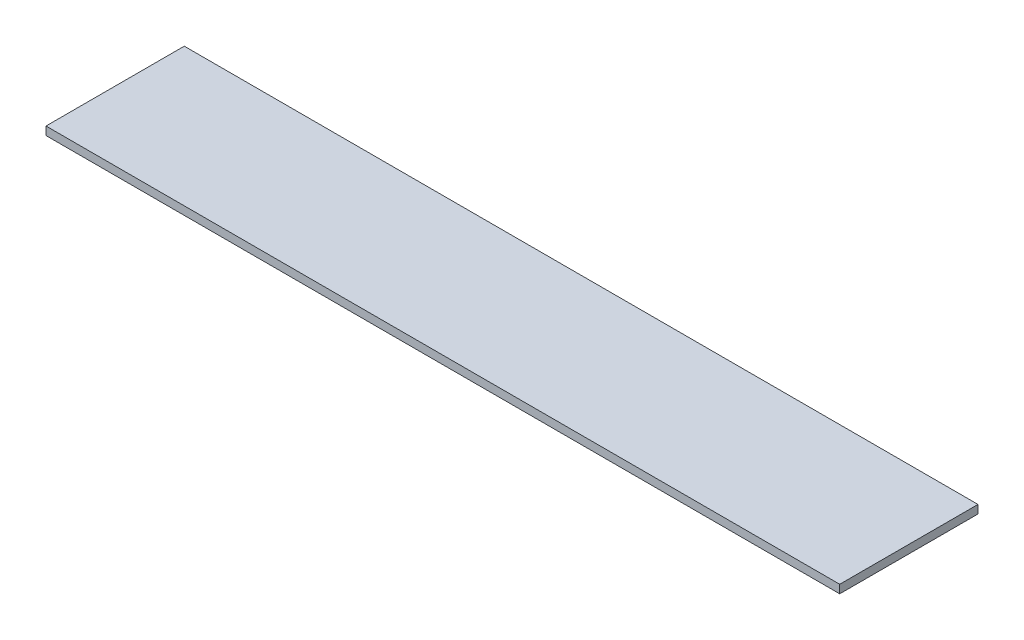
ISO-10303-21;
HEADER;
FILE_DESCRIPTION(('STEP AP214'),'2;1');
FILE_NAME('part.step','',(''),(''),'','','');
FILE_SCHEMA(('AUTOMOTIVE_DESIGN { 1 0 10303 214 1 1 1 1 }'));
ENDSEC;
DATA;
#1=APPLICATION_CONTEXT('core data for automotive mechanical design processes');
#2=APPLICATION_PROTOCOL_DEFINITION('international standard','automotive_design',2000,#1);
#3=PRODUCT_CONTEXT('',#1,'mechanical');
#4=PRODUCT('Part','Part','',(#3));
#5=PRODUCT_RELATED_PRODUCT_CATEGORY('part','',(#4));
#6=PRODUCT_DEFINITION_FORMATION('','',#4);
#7=PRODUCT_DEFINITION_CONTEXT('part definition',#1,'design');
#8=PRODUCT_DEFINITION('design','',#6,#7);
#9=PRODUCT_DEFINITION_SHAPE('','',#8);
#10=(LENGTH_UNIT() NAMED_UNIT(*) SI_UNIT(.MILLI.,.METRE.));
#11=(NAMED_UNIT(*) PLANE_ANGLE_UNIT() SI_UNIT($,.RADIAN.));
#12=(NAMED_UNIT(*) SI_UNIT($,.STERADIAN.) SOLID_ANGLE_UNIT());
#13=UNCERTAINTY_MEASURE_WITH_UNIT(LENGTH_MEASURE(1.E-05),#10,'distance_accuracy_value','');
#14=(GEOMETRIC_REPRESENTATION_CONTEXT(3) GLOBAL_UNCERTAINTY_ASSIGNED_CONTEXT((#13)) GLOBAL_UNIT_ASSIGNED_CONTEXT((#10,
#11,#12)) REPRESENTATION_CONTEXT('',''));
#15=CARTESIAN_POINT('',(0.,0.,0.));
#16=DIRECTION('',(0.,0.,1.));
#17=DIRECTION('',(1.,0.,0.));
#18=AXIS2_PLACEMENT_3D('',#15,#16,#17);
#19=CARTESIAN_POINT('',(143.5,3.,25.));
#20=DIRECTION('',(-1.,0.,0.));
#21=DIRECTION('',(0.,0.,1.));
#22=AXIS2_PLACEMENT_3D('',#19,#20,#21);
#23=PLANE('',#22);
#24=DIRECTION('',(0.,0.,-1.));
#25=VECTOR('',#24,1.);
#26=CARTESIAN_POINT('',(143.5,0.,25.));
#27=LINE('',#26,#25);
#28=CARTESIAN_POINT('',(143.5,0.,25.));
#29=VERTEX_POINT('',#28);
#30=CARTESIAN_POINT('',(143.5,0.,-25.));
#31=VERTEX_POINT('',#30);
#32=EDGE_CURVE('E100',#29,#31,#27,.T.);
#33=ORIENTED_EDGE('',*,*,#32,.T.);
#34=DIRECTION('',(0.,-1.,0.));
#35=VECTOR('',#34,1.);
#36=CARTESIAN_POINT('',(143.5,3.,-25.));
#37=LINE('',#36,#35);
#38=CARTESIAN_POINT('',(143.5,3.,-25.));
#39=VERTEX_POINT('',#38);
#40=EDGE_CURVE('E11',#39,#31,#37,.T.);
#41=ORIENTED_EDGE('',*,*,#40,.F.);
#42=DIRECTION('',(0.,0.,-1.));
#43=VECTOR('',#42,1.);
#44=CARTESIAN_POINT('',(143.5,3.,25.));
#45=LINE('',#44,#43);
#46=CARTESIAN_POINT('',(143.5,3.,25.));
#47=VERTEX_POINT('',#46);
#48=EDGE_CURVE('E88',#47,#39,#45,.T.);
#49=ORIENTED_EDGE('',*,*,#48,.F.);
#50=DIRECTION('',(0.,-1.,0.));
#51=VECTOR('',#50,1.);
#52=CARTESIAN_POINT('',(143.5,3.,25.));
#53=LINE('',#52,#51);
#54=EDGE_CURVE('E96',#47,#29,#53,.T.);
#55=ORIENTED_EDGE('',*,*,#54,.T.);
#56=EDGE_LOOP('',(#33,#41,#49,#55));
#57=FACE_BOUND('',#56,.T.);
#58=ADVANCED_FACE('F37',(#57),#23,.F.);
#59=CARTESIAN_POINT('',(-143.5,3.,-25.));
#60=DIRECTION('',(0.,0.,1.));
#61=DIRECTION('',(1.,0.,0.));
#62=AXIS2_PLACEMENT_3D('',#59,#60,#61);
#63=PLANE('',#62);
#64=DIRECTION('',(-1.,0.,0.));
#65=VECTOR('',#64,1.);
#66=CARTESIAN_POINT('',(-143.5,0.,-25.));
#67=LINE('',#66,#65);
#68=CARTESIAN_POINT('',(-143.5,0.,-25.));
#69=VERTEX_POINT('',#68);
#70=EDGE_CURVE('E92',#31,#69,#67,.T.);
#71=ORIENTED_EDGE('',*,*,#70,.T.);
#72=DIRECTION('',(0.,-1.,0.));
#73=VECTOR('',#72,1.);
#74=CARTESIAN_POINT('',(-143.5,3.,-25.));
#75=LINE('',#74,#73);
#76=CARTESIAN_POINT('',(-143.5,3.,-25.));
#77=VERTEX_POINT('',#76);
#78=EDGE_CURVE('E45',#77,#69,#75,.T.);
#79=ORIENTED_EDGE('',*,*,#78,.F.);
#80=DIRECTION('',(-1.,0.,0.));
#81=VECTOR('',#80,1.);
#82=CARTESIAN_POINT('',(-143.5,3.,-25.));
#83=LINE('',#82,#81);
#84=EDGE_CURVE('E83',#39,#77,#83,.T.);
#85=ORIENTED_EDGE('',*,*,#84,.F.);
#86=ORIENTED_EDGE('',*,*,#40,.T.);
#87=EDGE_LOOP('',(#71,#79,#85,#86));
#88=FACE_BOUND('',#87,.T.);
#89=ADVANCED_FACE('F91',(#88),#63,.F.);
#90=CARTESIAN_POINT('',(-143.5,3.,25.));
#91=DIRECTION('',(1.,0.,0.));
#92=DIRECTION('',(0.,0.,-1.));
#93=AXIS2_PLACEMENT_3D('',#90,#91,#92);
#94=PLANE('',#93);
#95=DIRECTION('',(0.,0.,1.));
#96=VECTOR('',#95,1.);
#97=CARTESIAN_POINT('',(-143.5,0.,25.));
#98=LINE('',#97,#96);
#99=CARTESIAN_POINT('',(-143.5,0.,25.));
#100=VERTEX_POINT('',#99);
#101=EDGE_CURVE('E70',#69,#100,#98,.T.);
#102=ORIENTED_EDGE('',*,*,#101,.T.);
#103=DIRECTION('',(0.,-1.,0.));
#104=VECTOR('',#103,1.);
#105=CARTESIAN_POINT('',(-143.5,3.,25.));
#106=LINE('',#105,#104);
#107=CARTESIAN_POINT('',(-143.5,3.,25.));
#108=VERTEX_POINT('',#107);
#109=EDGE_CURVE('E93',#108,#100,#106,.T.);
#110=ORIENTED_EDGE('',*,*,#109,.F.);
#111=DIRECTION('',(0.,0.,1.));
#112=VECTOR('',#111,1.);
#113=CARTESIAN_POINT('',(-143.5,3.,25.));
#114=LINE('',#113,#112);
#115=EDGE_CURVE('E86',#77,#108,#114,.T.);
#116=ORIENTED_EDGE('',*,*,#115,.F.);
#117=ORIENTED_EDGE('',*,*,#78,.T.);
#118=EDGE_LOOP('',(#102,#110,#116,#117));
#119=FACE_BOUND('',#118,.T.);
#120=ADVANCED_FACE('F94',(#119),#94,.F.);
#121=CARTESIAN_POINT('',(-143.5,3.,25.));
#122=DIRECTION('',(0.,0.,-1.));
#123=DIRECTION('',(-1.,0.,0.));
#124=AXIS2_PLACEMENT_3D('',#121,#122,#123);
#125=PLANE('',#124);
#126=DIRECTION('',(1.,0.,0.));
#127=VECTOR('',#126,1.);
#128=CARTESIAN_POINT('',(-143.5,0.,25.));
#129=LINE('',#128,#127);
#130=EDGE_CURVE('E76',#100,#29,#129,.T.);
#131=ORIENTED_EDGE('',*,*,#130,.T.);
#132=ORIENTED_EDGE('',*,*,#54,.F.);
#133=DIRECTION('',(1.,0.,0.));
#134=VECTOR('',#133,1.);
#135=CARTESIAN_POINT('',(-143.5,3.,25.));
#136=LINE('',#135,#134);
#137=EDGE_CURVE('E53',#108,#47,#136,.T.);
#138=ORIENTED_EDGE('',*,*,#137,.F.);
#139=ORIENTED_EDGE('',*,*,#109,.T.);
#140=EDGE_LOOP('',(#131,#132,#138,#139));
#141=FACE_BOUND('',#140,.T.);
#142=ADVANCED_FACE('F107',(#141),#125,.F.);
#143=CARTESIAN_POINT('',(0.,3.,0.));
#144=DIRECTION('',(0.,-1.,0.));
#145=DIRECTION('',(0.,0.,-1.));
#146=AXIS2_PLACEMENT_3D('',#143,#144,#145);
#147=PLANE('',#146);
#148=ORIENTED_EDGE('',*,*,#48,.T.);
#149=ORIENTED_EDGE('',*,*,#84,.T.);
#150=ORIENTED_EDGE('',*,*,#115,.T.);
#151=ORIENTED_EDGE('',*,*,#137,.T.);
#152=EDGE_LOOP('',(#148,#149,#150,#151));
#153=FACE_BOUND('',#152,.T.);
#154=ADVANCED_FACE('F84',(#153),#147,.F.);
#155=CARTESIAN_POINT('',(0.,0.,0.));
#156=DIRECTION('',(0.,-1.,0.));
#157=DIRECTION('',(0.,0.,-1.));
#158=AXIS2_PLACEMENT_3D('',#155,#156,#157);
#159=PLANE('',#158);
#160=ORIENTED_EDGE('',*,*,#32,.F.);
#161=ORIENTED_EDGE('',*,*,#130,.F.);
#162=ORIENTED_EDGE('',*,*,#101,.F.);
#163=ORIENTED_EDGE('',*,*,#70,.F.);
#164=EDGE_LOOP('',(#160,#161,#162,#163));
#165=FACE_BOUND('',#164,.T.);
#166=ADVANCED_FACE('F110',(#165),#159,.T.);
#167=CLOSED_SHELL('',(#58,#89,#120,#142,#154,#166));
#168=MANIFOLD_SOLID_BREP('B2',#167);
#169=ADVANCED_BREP_SHAPE_REPRESENTATION('',(#18,#168),#14);
#170=SHAPE_DEFINITION_REPRESENTATION(#9,#169);
ENDSEC;
END-ISO-10303-21;
